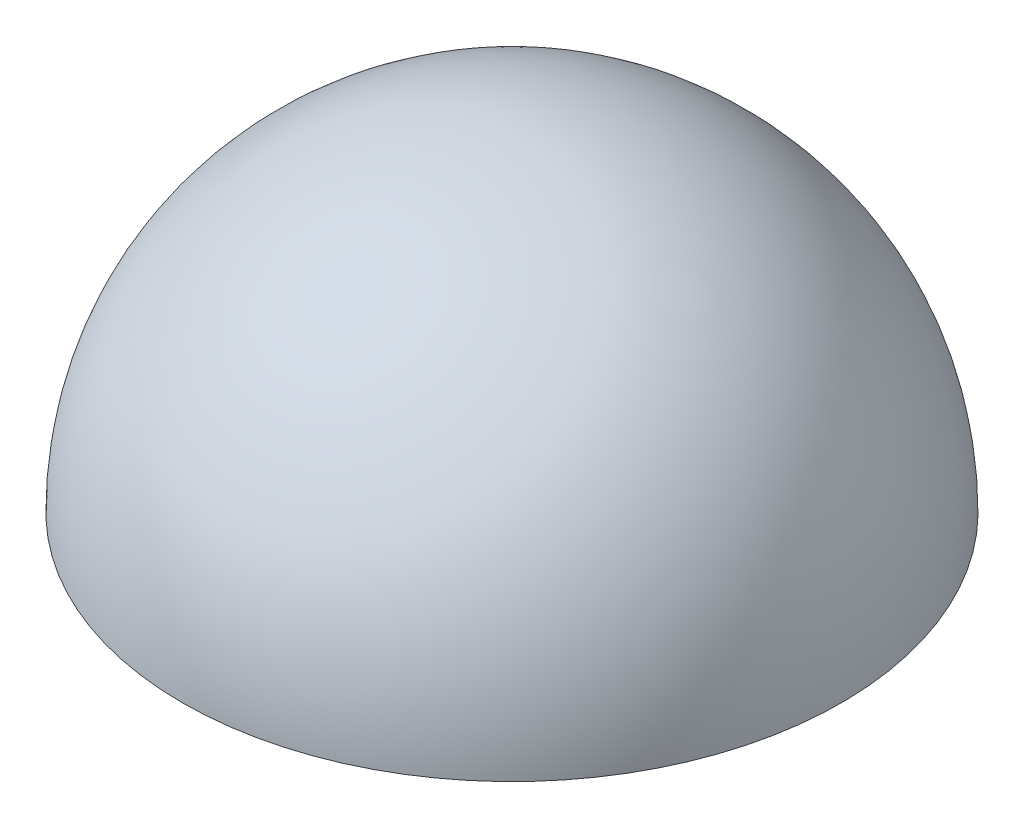
ISO-10303-21;
HEADER;
FILE_DESCRIPTION(('STEP AP214'),'2;1');
FILE_NAME('part.step','',(''),(''),'','','');
FILE_SCHEMA(('AUTOMOTIVE_DESIGN { 1 0 10303 214 1 1 1 1 }'));
ENDSEC;
DATA;
#1=APPLICATION_CONTEXT('core data for automotive mechanical design processes');
#2=APPLICATION_PROTOCOL_DEFINITION('international standard','automotive_design',2000,#1);
#3=PRODUCT_CONTEXT('',#1,'mechanical');
#4=PRODUCT('Part','Part','',(#3));
#5=PRODUCT_RELATED_PRODUCT_CATEGORY('part','',(#4));
#6=PRODUCT_DEFINITION_FORMATION('','',#4);
#7=PRODUCT_DEFINITION_CONTEXT('part definition',#1,'design');
#8=PRODUCT_DEFINITION('design','',#6,#7);
#9=PRODUCT_DEFINITION_SHAPE('','',#8);
#10=(LENGTH_UNIT() NAMED_UNIT(*) SI_UNIT(.MILLI.,.METRE.));
#11=(NAMED_UNIT(*) PLANE_ANGLE_UNIT() SI_UNIT($,.RADIAN.));
#12=(NAMED_UNIT(*) SI_UNIT($,.STERADIAN.) SOLID_ANGLE_UNIT());
#13=UNCERTAINTY_MEASURE_WITH_UNIT(LENGTH_MEASURE(1.E-05),#10,'distance_accuracy_value','');
#14=(GEOMETRIC_REPRESENTATION_CONTEXT(3) GLOBAL_UNCERTAINTY_ASSIGNED_CONTEXT((#13)) GLOBAL_UNIT_ASSIGNED_CONTEXT((#10,
#11,#12)) REPRESENTATION_CONTEXT('',''));
#15=CARTESIAN_POINT('',(0.,0.,0.));
#16=DIRECTION('',(0.,0.,1.));
#17=DIRECTION('',(1.,0.,0.));
#18=AXIS2_PLACEMENT_3D('',#15,#16,#17);
#19=CARTESIAN_POINT('',(1.49700985139427,0.,1.95031535132306));
#20=DIRECTION('',(-0.999999906075553,0.,-0.000433415371802546));
#21=DIRECTION('',(-0.000433415371802546,0.,0.999999906075553));
#22=AXIS2_PLACEMENT_3D('',#19,#20,#21);
#23=SPHERICAL_SURFACE('',#22,25.4);
#24=CARTESIAN_POINT('',(1.49700985139427,0.,1.95031535132306));
#25=DIRECTION('',(0.,-1.,0.));
#26=DIRECTION('',(-0.000866830662188493,0.,0.999999624302231));
#27=AXIS2_PLACEMENT_3D('',#24,#25,#26);
#28=SPHERICAL_SURFACE('',#27,25.4);
#29=CARTESIAN_POINT('',(1.49700985139427,0.,1.95031535132306));
#30=DIRECTION('',(0.,-1.,0.));
#31=DIRECTION('',(-0.000866830662188493,0.,0.999999624302231));
#32=AXIS2_PLACEMENT_3D('',#29,#30,#31);
#33=CIRCLE('',#32,25.4);
#34=CARTESIAN_POINT('',(1.47499235257468,-1.7736723535411E-13,27.3503058085997));
#35=VERTEX_POINT('',#34);
#36=EDGE_CURVE('E10',#35,#35,#33,.T.);
#37=ORIENTED_EDGE('',*,*,#36,.F.);
#38=EDGE_LOOP('',(#37));
#39=FACE_BOUND('',#38,.T.);
#40=ADVANCED_FACE('F33',(#39),#28,.T.);
#41=CARTESIAN_POINT('',(1.49700985139427,0.,1.95031535132306));
#42=DIRECTION('',(0.,1.,0.));
#43=DIRECTION('',(-0.000866830662188493,0.,0.999999624302231));
#44=AXIS2_PLACEMENT_3D('',#41,#42,#43);
#45=PLANE('',#44);
#46=CARTESIAN_POINT('',(1.49700985139427,0.,1.95031535132306));
#47=DIRECTION('',(0.,1.,0.));
#48=DIRECTION('',(0.,0.,1.));
#49=AXIS2_PLACEMENT_3D('',#46,#47,#48);
#50=CIRCLE('',#49,24.13);
#51=CARTESIAN_POINT('',(1.49700985139427,-1.68498873586405E-13,26.0803153513231));
#52=VERTEX_POINT('',#51);
#53=EDGE_CURVE('E39',#52,#52,#50,.F.);
#54=ORIENTED_EDGE('',*,*,#53,.F.);
#55=EDGE_LOOP('',(#54));
#56=FACE_BOUND('',#55,.T.);
#57=ORIENTED_EDGE('',*,*,#36,.T.);
#58=EDGE_LOOP('',(#57));
#59=FACE_BOUND('',#58,.T.);
#60=ADVANCED_FACE('F47',(#56,#59),#45,.F.);
#61=CARTESIAN_POINT('',(1.49700985139427,0.,1.95031535132306));
#62=DIRECTION('',(-0.999999906075553,0.,-0.000433415371802546));
#63=DIRECTION('',(-0.000433415371802546,0.,0.999999906075553));
#64=AXIS2_PLACEMENT_3D('',#61,#62,#63);
#65=SPHERICAL_SURFACE('',#64,24.13);
#66=CARTESIAN_POINT('',(1.49700985139427,0.,1.95031535132306));
#67=DIRECTION('',(0.,1.,0.));
#68=DIRECTION('',(0.,0.,1.));
#69=AXIS2_PLACEMENT_3D('',#66,#67,#68);
#70=SPHERICAL_SURFACE('',#69,24.13);
#71=ORIENTED_EDGE('',*,*,#53,.T.);
#72=EDGE_LOOP('',(#71));
#73=FACE_BOUND('',#72,.T.);
#74=ADVANCED_FACE('F45',(#73),#70,.F.);
#75=CLOSED_SHELL('',(#40,#60,#74));
#76=MANIFOLD_SOLID_BREP('B2',#75);
#77=ADVANCED_BREP_SHAPE_REPRESENTATION('',(#18,#76),#14);
#78=SHAPE_DEFINITION_REPRESENTATION(#9,#77);
ENDSEC;
END-ISO-10303-21;
